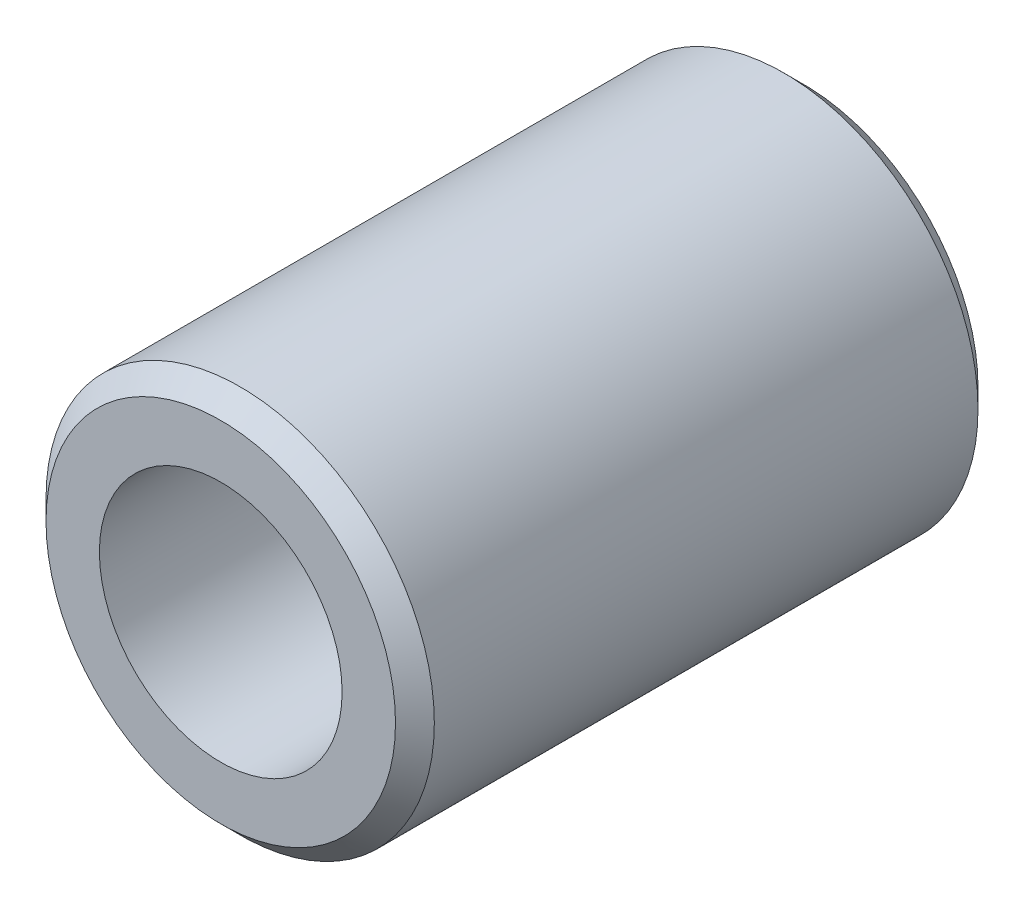
ISO-10303-21;
HEADER;
FILE_DESCRIPTION(('STEP AP214'),'2;1');
FILE_NAME('part.step','',(''),(''),'','','');
FILE_SCHEMA(('AUTOMOTIVE_DESIGN { 1 0 10303 214 1 1 1 1 }'));
ENDSEC;
DATA;
#1=APPLICATION_CONTEXT('core data for automotive mechanical design processes');
#2=APPLICATION_PROTOCOL_DEFINITION('international standard','automotive_design',2000,#1);
#3=PRODUCT_CONTEXT('',#1,'mechanical');
#4=PRODUCT('Part','Part','',(#3));
#5=PRODUCT_RELATED_PRODUCT_CATEGORY('part','',(#4));
#6=PRODUCT_DEFINITION_FORMATION('','',#4);
#7=PRODUCT_DEFINITION_CONTEXT('part definition',#1,'design');
#8=PRODUCT_DEFINITION('design','',#6,#7);
#9=PRODUCT_DEFINITION_SHAPE('','',#8);
#10=(LENGTH_UNIT() NAMED_UNIT(*) SI_UNIT(.MILLI.,.METRE.));
#11=(NAMED_UNIT(*) PLANE_ANGLE_UNIT() SI_UNIT($,.RADIAN.));
#12=(NAMED_UNIT(*) SI_UNIT($,.STERADIAN.) SOLID_ANGLE_UNIT());
#13=UNCERTAINTY_MEASURE_WITH_UNIT(LENGTH_MEASURE(1.E-05),#10,'distance_accuracy_value','');
#14=(GEOMETRIC_REPRESENTATION_CONTEXT(3) GLOBAL_UNCERTAINTY_ASSIGNED_CONTEXT((#13)) GLOBAL_UNIT_ASSIGNED_CONTEXT((#10,
#11,#12)) REPRESENTATION_CONTEXT('',''));
#15=CARTESIAN_POINT('',(0.,0.,0.));
#16=DIRECTION('',(0.,0.,1.));
#17=DIRECTION('',(1.,0.,0.));
#18=AXIS2_PLACEMENT_3D('',#15,#16,#17);
#19=CARTESIAN_POINT('',(0.,0.,60.));
#20=DIRECTION('',(0.,0.,1.));
#21=DIRECTION('',(1.,0.,0.));
#22=AXIS2_PLACEMENT_3D('',#19,#20,#21);
#23=PLANE('',#22);
#24=CARTESIAN_POINT('',(0.,0.,60.));
#25=DIRECTION('',(0.,0.,1.));
#26=DIRECTION('',(1.,0.,0.));
#27=AXIS2_PLACEMENT_3D('',#24,#25,#26);
#28=CIRCLE('',#27,18.);
#29=CARTESIAN_POINT('',(18.,0.,60.));
#30=VERTEX_POINT('',#29);
#31=EDGE_CURVE('E53',#30,#30,#28,.T.);
#32=ORIENTED_EDGE('',*,*,#31,.T.);
#33=EDGE_LOOP('',(#32));
#34=FACE_BOUND('',#33,.T.);
#35=CARTESIAN_POINT('',(0.,0.,60.));
#36=DIRECTION('',(0.,0.,1.));
#37=DIRECTION('',(1.,0.,0.));
#38=AXIS2_PLACEMENT_3D('',#35,#36,#37);
#39=CIRCLE('',#38,12.5);
#40=CARTESIAN_POINT('',(12.5,0.,60.));
#41=VERTEX_POINT('',#40);
#42=EDGE_CURVE('E58',#41,#41,#39,.T.);
#43=ORIENTED_EDGE('',*,*,#42,.F.);
#44=EDGE_LOOP('',(#43));
#45=FACE_BOUND('',#44,.T.);
#46=ADVANCED_FACE('F37',(#34,#45),#23,.T.);
#47=CARTESIAN_POINT('',(0.,0.,0.));
#48=DIRECTION('',(0.,0.,1.));
#49=DIRECTION('',(1.,0.,0.));
#50=AXIS2_PLACEMENT_3D('',#47,#48,#49);
#51=PLANE('',#50);
#52=CARTESIAN_POINT('',(0.,0.,0.));
#53=DIRECTION('',(0.,0.,1.));
#54=DIRECTION('',(1.,0.,0.));
#55=AXIS2_PLACEMENT_3D('',#52,#53,#54);
#56=CIRCLE('',#55,18.);
#57=CARTESIAN_POINT('',(18.,0.,0.));
#58=VERTEX_POINT('',#57);
#59=EDGE_CURVE('E10',#58,#58,#56,.F.);
#60=ORIENTED_EDGE('',*,*,#59,.T.);
#61=EDGE_LOOP('',(#60));
#62=FACE_BOUND('',#61,.T.);
#63=CARTESIAN_POINT('',(0.,0.,0.));
#64=DIRECTION('',(0.,0.,1.));
#65=DIRECTION('',(1.,0.,0.));
#66=AXIS2_PLACEMENT_3D('',#63,#64,#65);
#67=CIRCLE('',#66,12.5);
#68=CARTESIAN_POINT('',(12.5,0.,0.));
#69=VERTEX_POINT('',#68);
#70=EDGE_CURVE('E59',#69,#69,#67,.T.);
#71=ORIENTED_EDGE('',*,*,#70,.T.);
#72=EDGE_LOOP('',(#71));
#73=FACE_BOUND('',#72,.T.);
#74=ADVANCED_FACE('F69',(#62,#73),#51,.F.);
#75=CARTESIAN_POINT('',(0.,0.,60.));
#76=DIRECTION('',(0.,0.,-1.));
#77=DIRECTION('',(-1.,0.,0.));
#78=AXIS2_PLACEMENT_3D('',#75,#76,#77);
#79=CYLINDRICAL_SURFACE('',#78,20.);
#80=CARTESIAN_POINT('',(0.,0.,58.));
#81=DIRECTION('',(0.,0.,1.));
#82=DIRECTION('',(1.,0.,0.));
#83=AXIS2_PLACEMENT_3D('',#80,#81,#82);
#84=CIRCLE('',#83,20.);
#85=CARTESIAN_POINT('',(20.,0.,58.));
#86=VERTEX_POINT('',#85);
#87=EDGE_CURVE('E45',#86,#86,#84,.F.);
#88=ORIENTED_EDGE('',*,*,#87,.T.);
#89=EDGE_LOOP('',(#88));
#90=FACE_BOUND('',#89,.T.);
#91=CARTESIAN_POINT('',(0.,0.,1.99999999999999));
#92=DIRECTION('',(0.,0.,1.));
#93=DIRECTION('',(1.,0.,0.));
#94=AXIS2_PLACEMENT_3D('',#91,#92,#93);
#95=CIRCLE('',#94,20.);
#96=CARTESIAN_POINT('',(20.,0.,1.99999999999999));
#97=VERTEX_POINT('',#96);
#98=EDGE_CURVE('E49',#97,#97,#95,.T.);
#99=ORIENTED_EDGE('',*,*,#98,.T.);
#100=EDGE_LOOP('',(#99));
#101=FACE_BOUND('',#100,.T.);
#102=ADVANCED_FACE('F75',(#90,#101),#79,.T.);
#103=CARTESIAN_POINT('',(0.,0.,60.));
#104=DIRECTION('',(0.,0.,-1.));
#105=DIRECTION('',(-1.,0.,0.));
#106=AXIS2_PLACEMENT_3D('',#103,#104,#105);
#107=CYLINDRICAL_SURFACE('',#106,12.5);
#108=ORIENTED_EDGE('',*,*,#42,.T.);
#109=EDGE_LOOP('',(#108));
#110=FACE_BOUND('',#109,.T.);
#111=ORIENTED_EDGE('',*,*,#70,.F.);
#112=EDGE_LOOP('',(#111));
#113=FACE_BOUND('',#112,.T.);
#114=ADVANCED_FACE('F65',(#110,#113),#107,.F.);
#115=CARTESIAN_POINT('',(0.,0.,60.));
#116=DIRECTION('',(0.,0.,-1.));
#117=DIRECTION('',(-1.,0.,0.));
#118=AXIS2_PLACEMENT_3D('',#115,#116,#117);
#119=CONICAL_SURFACE('',#118,18.,0.78539816339745);
#120=ORIENTED_EDGE('',*,*,#87,.F.);
#121=EDGE_LOOP('',(#120));
#122=FACE_BOUND('',#121,.T.);
#123=ORIENTED_EDGE('',*,*,#31,.F.);
#124=EDGE_LOOP('',(#123));
#125=FACE_BOUND('',#124,.T.);
#126=ADVANCED_FACE('F81',(#122,#125),#119,.T.);
#127=CARTESIAN_POINT('',(0.,0.,1.99999999999999));
#128=DIRECTION('',(0.,0.,1.));
#129=DIRECTION('',(1.,0.,0.));
#130=AXIS2_PLACEMENT_3D('',#127,#128,#129);
#131=CONICAL_SURFACE('',#130,20.,0.78539816339745);
#132=ORIENTED_EDGE('',*,*,#59,.F.);
#133=EDGE_LOOP('',(#132));
#134=FACE_BOUND('',#133,.T.);
#135=ORIENTED_EDGE('',*,*,#98,.F.);
#136=EDGE_LOOP('',(#135));
#137=FACE_BOUND('',#136,.T.);
#138=ADVANCED_FACE('F40',(#134,#137),#131,.T.);
#139=CLOSED_SHELL('',(#46,#74,#102,#114,#126,#138));
#140=MANIFOLD_SOLID_BREP('B2',#139);
#141=ADVANCED_BREP_SHAPE_REPRESENTATION('',(#18,#140),#14);
#142=SHAPE_DEFINITION_REPRESENTATION(#9,#141);
ENDSEC;
END-ISO-10303-21;
